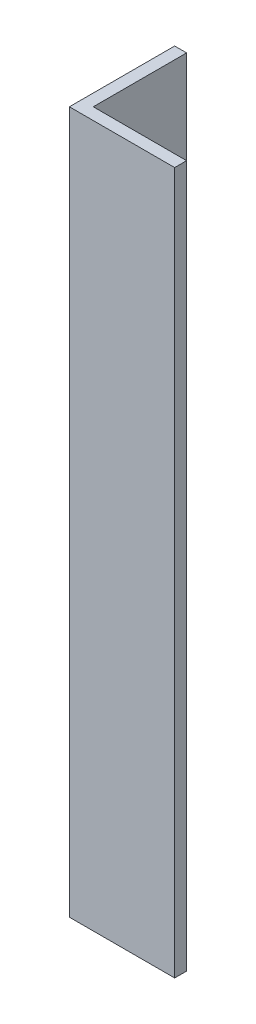
ISO-10303-21;
HEADER;
FILE_DESCRIPTION(('STEP AP214'),'2;1');
FILE_NAME('part.step','',(''),(''),'','','');
FILE_SCHEMA(('AUTOMOTIVE_DESIGN { 1 0 10303 214 1 1 1 1 }'));
ENDSEC;
DATA;
#1=APPLICATION_CONTEXT('core data for automotive mechanical design processes');
#2=APPLICATION_PROTOCOL_DEFINITION('international standard','automotive_design',2000,#1);
#3=PRODUCT_CONTEXT('',#1,'mechanical');
#4=PRODUCT('Part','Part','',(#3));
#5=PRODUCT_RELATED_PRODUCT_CATEGORY('part','',(#4));
#6=PRODUCT_DEFINITION_FORMATION('','',#4);
#7=PRODUCT_DEFINITION_CONTEXT('part definition',#1,'design');
#8=PRODUCT_DEFINITION('design','',#6,#7);
#9=PRODUCT_DEFINITION_SHAPE('','',#8);
#10=(LENGTH_UNIT() NAMED_UNIT(*) SI_UNIT(.MILLI.,.METRE.));
#11=(NAMED_UNIT(*) PLANE_ANGLE_UNIT() SI_UNIT($,.RADIAN.));
#12=(NAMED_UNIT(*) SI_UNIT($,.STERADIAN.) SOLID_ANGLE_UNIT());
#13=UNCERTAINTY_MEASURE_WITH_UNIT(LENGTH_MEASURE(1.E-05),#10,'distance_accuracy_value','');
#14=(GEOMETRIC_REPRESENTATION_CONTEXT(3) GLOBAL_UNCERTAINTY_ASSIGNED_CONTEXT((#13)) GLOBAL_UNIT_ASSIGNED_CONTEXT((#10,
#11,#12)) REPRESENTATION_CONTEXT('',''));
#15=CARTESIAN_POINT('',(0.,0.,0.));
#16=DIRECTION('',(0.,0.,1.));
#17=DIRECTION('',(1.,0.,0.));
#18=AXIS2_PLACEMENT_3D('',#15,#16,#17);
#19=CARTESIAN_POINT('',(0.,200.,0.));
#20=DIRECTION('',(0.,0.,-1.));
#21=DIRECTION('',(-1.,0.,0.));
#22=AXIS2_PLACEMENT_3D('',#19,#20,#21);
#23=PLANE('',#22);
#24=DIRECTION('',(1.,0.,0.));
#25=VECTOR('',#24,1.);
#26=CARTESIAN_POINT('',(0.,0.,0.));
#27=LINE('',#26,#25);
#28=CARTESIAN_POINT('',(0.,0.,0.));
#29=VERTEX_POINT('',#28);
#30=CARTESIAN_POINT('',(30.,0.,0.));
#31=VERTEX_POINT('',#30);
#32=EDGE_CURVE('E133',#29,#31,#27,.T.);
#33=ORIENTED_EDGE('',*,*,#32,.T.);
#34=DIRECTION('',(0.,-1.,0.));
#35=VECTOR('',#34,1.);
#36=CARTESIAN_POINT('',(30.,200.,0.));
#37=LINE('',#36,#35);
#38=CARTESIAN_POINT('',(30.,200.,0.));
#39=VERTEX_POINT('',#38);
#40=EDGE_CURVE('E11',#39,#31,#37,.T.);
#41=ORIENTED_EDGE('',*,*,#40,.F.);
#42=DIRECTION('',(1.,0.,0.));
#43=VECTOR('',#42,1.);
#44=CARTESIAN_POINT('',(0.,200.,0.));
#45=LINE('',#44,#43);
#46=CARTESIAN_POINT('',(0.,200.,0.));
#47=VERTEX_POINT('',#46);
#48=EDGE_CURVE('E149',#47,#39,#45,.T.);
#49=ORIENTED_EDGE('',*,*,#48,.F.);
#50=DIRECTION('',(0.,-1.,0.));
#51=VECTOR('',#50,1.);
#52=CARTESIAN_POINT('',(0.,200.,0.));
#53=LINE('',#52,#51);
#54=EDGE_CURVE('E129',#47,#29,#53,.T.);
#55=ORIENTED_EDGE('',*,*,#54,.T.);
#56=EDGE_LOOP('',(#33,#41,#49,#55));
#57=FACE_BOUND('',#56,.T.);
#58=ADVANCED_FACE('F44',(#57),#23,.F.);
#59=CARTESIAN_POINT('',(30.,200.,0.));
#60=DIRECTION('',(-1.,0.,0.));
#61=DIRECTION('',(0.,0.,1.));
#62=AXIS2_PLACEMENT_3D('',#59,#60,#61);
#63=PLANE('',#62);
#64=DIRECTION('',(0.,0.,-1.));
#65=VECTOR('',#64,1.);
#66=CARTESIAN_POINT('',(30.,0.,0.));
#67=LINE('',#66,#65);
#68=CARTESIAN_POINT('',(30.,0.,-3.4));
#69=VERTEX_POINT('',#68);
#70=EDGE_CURVE('E137',#31,#69,#67,.T.);
#71=ORIENTED_EDGE('',*,*,#70,.T.);
#72=DIRECTION('',(0.,-1.,0.));
#73=VECTOR('',#72,1.);
#74=CARTESIAN_POINT('',(30.,200.,-3.4));
#75=LINE('',#74,#73);
#76=CARTESIAN_POINT('',(30.,200.,-3.4));
#77=VERTEX_POINT('',#76);
#78=EDGE_CURVE('E53',#77,#69,#75,.T.);
#79=ORIENTED_EDGE('',*,*,#78,.F.);
#80=DIRECTION('',(0.,0.,-1.));
#81=VECTOR('',#80,1.);
#82=CARTESIAN_POINT('',(30.,200.,0.));
#83=LINE('',#82,#81);
#84=EDGE_CURVE('E98',#39,#77,#83,.T.);
#85=ORIENTED_EDGE('',*,*,#84,.F.);
#86=ORIENTED_EDGE('',*,*,#40,.T.);
#87=EDGE_LOOP('',(#71,#79,#85,#86));
#88=FACE_BOUND('',#87,.T.);
#89=ADVANCED_FACE('F177',(#88),#63,.F.);
#90=CARTESIAN_POINT('',(3.4,200.,-3.4));
#91=DIRECTION('',(0.,0.,1.));
#92=DIRECTION('',(1.,0.,0.));
#93=AXIS2_PLACEMENT_3D('',#90,#91,#92);
#94=PLANE('',#93);
#95=DIRECTION('',(-1.,0.,0.));
#96=VECTOR('',#95,1.);
#97=CARTESIAN_POINT('',(3.4,0.,-3.4));
#98=LINE('',#97,#96);
#99=CARTESIAN_POINT('',(3.4,0.,-3.4));
#100=VERTEX_POINT('',#99);
#101=EDGE_CURVE('E140',#69,#100,#98,.T.);
#102=ORIENTED_EDGE('',*,*,#101,.T.);
#103=DIRECTION('',(0.,-1.,0.));
#104=VECTOR('',#103,1.);
#105=CARTESIAN_POINT('',(3.4,200.,-3.4));
#106=LINE('',#105,#104);
#107=CARTESIAN_POINT('',(3.4,200.,-3.4));
#108=VERTEX_POINT('',#107);
#109=EDGE_CURVE('E122',#108,#100,#106,.T.);
#110=ORIENTED_EDGE('',*,*,#109,.F.);
#111=DIRECTION('',(-1.,0.,0.));
#112=VECTOR('',#111,1.);
#113=CARTESIAN_POINT('',(3.4,200.,-3.4));
#114=LINE('',#113,#112);
#115=EDGE_CURVE('E111',#77,#108,#114,.T.);
#116=ORIENTED_EDGE('',*,*,#115,.F.);
#117=ORIENTED_EDGE('',*,*,#78,.T.);
#118=EDGE_LOOP('',(#102,#110,#116,#117));
#119=FACE_BOUND('',#118,.T.);
#120=ADVANCED_FACE('F159',(#119),#94,.F.);
#121=CARTESIAN_POINT('',(3.4,200.,-30.));
#122=DIRECTION('',(-1.,0.,0.));
#123=DIRECTION('',(0.,0.,1.));
#124=AXIS2_PLACEMENT_3D('',#121,#122,#123);
#125=PLANE('',#124);
#126=DIRECTION('',(0.,0.,-1.));
#127=VECTOR('',#126,1.);
#128=CARTESIAN_POINT('',(3.4,0.,-30.));
#129=LINE('',#128,#127);
#130=CARTESIAN_POINT('',(3.4,0.,-30.));
#131=VERTEX_POINT('',#130);
#132=EDGE_CURVE('E120',#100,#131,#129,.T.);
#133=ORIENTED_EDGE('',*,*,#132,.T.);
#134=DIRECTION('',(0.,-1.,0.));
#135=VECTOR('',#134,1.);
#136=CARTESIAN_POINT('',(3.4,200.,-30.));
#137=LINE('',#136,#135);
#138=CARTESIAN_POINT('',(3.4,200.,-30.));
#139=VERTEX_POINT('',#138);
#140=EDGE_CURVE('E117',#139,#131,#137,.T.);
#141=ORIENTED_EDGE('',*,*,#140,.F.);
#142=DIRECTION('',(0.,0.,-1.));
#143=VECTOR('',#142,1.);
#144=CARTESIAN_POINT('',(3.4,200.,-30.));
#145=LINE('',#144,#143);
#146=EDGE_CURVE('E105',#108,#139,#145,.T.);
#147=ORIENTED_EDGE('',*,*,#146,.F.);
#148=ORIENTED_EDGE('',*,*,#109,.T.);
#149=EDGE_LOOP('',(#133,#141,#147,#148));
#150=FACE_BOUND('',#149,.T.);
#151=ADVANCED_FACE('F118',(#150),#125,.F.);
#152=CARTESIAN_POINT('',(0.,200.,-30.));
#153=DIRECTION('',(0.,0.,1.));
#154=DIRECTION('',(1.,0.,0.));
#155=AXIS2_PLACEMENT_3D('',#152,#153,#154);
#156=PLANE('',#155);
#157=DIRECTION('',(-1.,0.,0.));
#158=VECTOR('',#157,1.);
#159=CARTESIAN_POINT('',(0.,0.,-30.));
#160=LINE('',#159,#158);
#161=CARTESIAN_POINT('',(0.,0.,-30.));
#162=VERTEX_POINT('',#161);
#163=EDGE_CURVE('E84',#131,#162,#160,.T.);
#164=ORIENTED_EDGE('',*,*,#163,.T.);
#165=DIRECTION('',(0.,-1.,0.));
#166=VECTOR('',#165,1.);
#167=CARTESIAN_POINT('',(0.,200.,-30.));
#168=LINE('',#167,#166);
#169=CARTESIAN_POINT('',(0.,200.,-30.));
#170=VERTEX_POINT('',#169);
#171=EDGE_CURVE('E123',#170,#162,#168,.T.);
#172=ORIENTED_EDGE('',*,*,#171,.F.);
#173=DIRECTION('',(-1.,0.,0.));
#174=VECTOR('',#173,1.);
#175=CARTESIAN_POINT('',(0.,200.,-30.));
#176=LINE('',#175,#174);
#177=EDGE_CURVE('E109',#139,#170,#176,.T.);
#178=ORIENTED_EDGE('',*,*,#177,.F.);
#179=ORIENTED_EDGE('',*,*,#140,.T.);
#180=EDGE_LOOP('',(#164,#172,#178,#179));
#181=FACE_BOUND('',#180,.T.);
#182=ADVANCED_FACE('F125',(#181),#156,.F.);
#183=CARTESIAN_POINT('',(0.,200.,0.));
#184=DIRECTION('',(1.,0.,0.));
#185=DIRECTION('',(0.,0.,-1.));
#186=AXIS2_PLACEMENT_3D('',#183,#184,#185);
#187=PLANE('',#186);
#188=DIRECTION('',(0.,0.,1.));
#189=VECTOR('',#188,1.);
#190=CARTESIAN_POINT('',(0.,0.,0.));
#191=LINE('',#190,#189);
#192=EDGE_CURVE('E90',#162,#29,#191,.T.);
#193=ORIENTED_EDGE('',*,*,#192,.T.);
#194=ORIENTED_EDGE('',*,*,#54,.F.);
#195=DIRECTION('',(0.,0.,1.));
#196=VECTOR('',#195,1.);
#197=CARTESIAN_POINT('',(0.,200.,0.));
#198=LINE('',#197,#196);
#199=EDGE_CURVE('E61',#170,#47,#198,.T.);
#200=ORIENTED_EDGE('',*,*,#199,.F.);
#201=ORIENTED_EDGE('',*,*,#171,.T.);
#202=EDGE_LOOP('',(#193,#194,#200,#201));
#203=FACE_BOUND('',#202,.T.);
#204=ADVANCED_FACE('F166',(#203),#187,.F.);
#205=CARTESIAN_POINT('',(0.,200.,0.));
#206=DIRECTION('',(0.,1.,0.));
#207=DIRECTION('',(0.,0.,1.));
#208=AXIS2_PLACEMENT_3D('',#205,#206,#207);
#209=PLANE('',#208);
#210=ORIENTED_EDGE('',*,*,#48,.T.);
#211=ORIENTED_EDGE('',*,*,#84,.T.);
#212=ORIENTED_EDGE('',*,*,#115,.T.);
#213=ORIENTED_EDGE('',*,*,#146,.T.);
#214=ORIENTED_EDGE('',*,*,#177,.T.);
#215=ORIENTED_EDGE('',*,*,#199,.T.);
#216=EDGE_LOOP('',(#210,#211,#212,#213,#214,#215));
#217=FACE_BOUND('',#216,.T.);
#218=ADVANCED_FACE('F107',(#217),#209,.T.);
#219=CARTESIAN_POINT('',(0.,0.,0.));
#220=DIRECTION('',(0.,1.,0.));
#221=DIRECTION('',(0.,0.,1.));
#222=AXIS2_PLACEMENT_3D('',#219,#220,#221);
#223=PLANE('',#222);
#224=ORIENTED_EDGE('',*,*,#32,.F.);
#225=ORIENTED_EDGE('',*,*,#192,.F.);
#226=ORIENTED_EDGE('',*,*,#163,.F.);
#227=ORIENTED_EDGE('',*,*,#132,.F.);
#228=ORIENTED_EDGE('',*,*,#101,.F.);
#229=ORIENTED_EDGE('',*,*,#70,.F.);
#230=EDGE_LOOP('',(#224,#225,#226,#227,#228,#229));
#231=FACE_BOUND('',#230,.T.);
#232=ADVANCED_FACE('F162',(#231),#223,.F.);
#233=CLOSED_SHELL('',(#58,#89,#120,#151,#182,#204,#218,#232));
#234=MANIFOLD_SOLID_BREP('B2',#233);
#235=ADVANCED_BREP_SHAPE_REPRESENTATION('',(#18,#234),#14);
#236=SHAPE_DEFINITION_REPRESENTATION(#9,#235);
ENDSEC;
END-ISO-10303-21;
